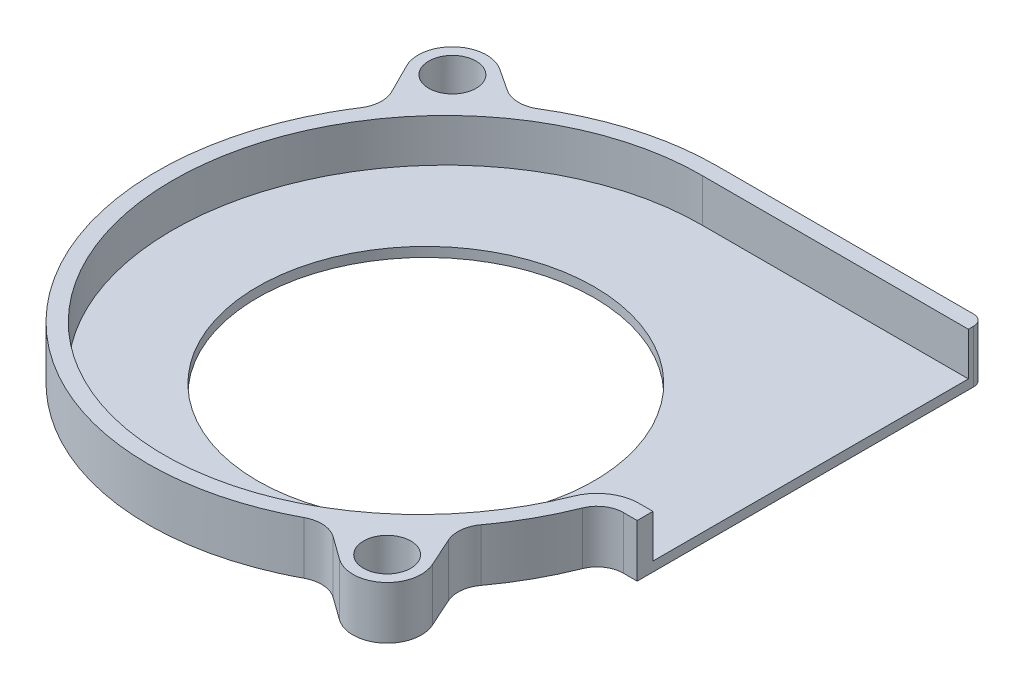
ISO-10303-21;
HEADER;
FILE_DESCRIPTION(('STEP AP214'),'2;1');
FILE_NAME('part.step','',(''),(''),'','','');
FILE_SCHEMA(('AUTOMOTIVE_DESIGN { 1 0 10303 214 1 1 1 1 }'));
ENDSEC;
DATA;
#1=APPLICATION_CONTEXT('core data for automotive mechanical design processes');
#2=APPLICATION_PROTOCOL_DEFINITION('international standard','automotive_design',2000,#1);
#3=PRODUCT_CONTEXT('',#1,'mechanical');
#4=PRODUCT('Part','Part','',(#3));
#5=PRODUCT_RELATED_PRODUCT_CATEGORY('part','',(#4));
#6=PRODUCT_DEFINITION_FORMATION('','',#4);
#7=PRODUCT_DEFINITION_CONTEXT('part definition',#1,'design');
#8=PRODUCT_DEFINITION('design','',#6,#7);
#9=PRODUCT_DEFINITION_SHAPE('','',#8);
#10=(LENGTH_UNIT() NAMED_UNIT(*) SI_UNIT(.MILLI.,.METRE.));
#11=(NAMED_UNIT(*) PLANE_ANGLE_UNIT() SI_UNIT($,.RADIAN.));
#12=(NAMED_UNIT(*) SI_UNIT($,.STERADIAN.) SOLID_ANGLE_UNIT());
#13=UNCERTAINTY_MEASURE_WITH_UNIT(LENGTH_MEASURE(1.E-05),#10,'distance_accuracy_value','');
#14=(GEOMETRIC_REPRESENTATION_CONTEXT(3) GLOBAL_UNCERTAINTY_ASSIGNED_CONTEXT((#13)) GLOBAL_UNIT_ASSIGNED_CONTEXT((#10,
#11,#12)) REPRESENTATION_CONTEXT('',''));
#15=CARTESIAN_POINT('',(0.,0.,0.));
#16=DIRECTION('',(0.,0.,1.));
#17=DIRECTION('',(1.,0.,0.));
#18=AXIS2_PLACEMENT_3D('',#15,#16,#17);
#19=CARTESIAN_POINT('',(-1.25,0.91,-1.9));
#20=DIRECTION('',(0.,1.,0.));
#21=DIRECTION('',(0.,0.,1.));
#22=AXIS2_PLACEMENT_3D('',#19,#20,#21);
#23=PLANE('',#22);
#24=CARTESIAN_POINT('',(0.,0.91,0.));
#25=DIRECTION('',(0.,1.,0.));
#26=DIRECTION('',(0.,0.,1.));
#27=AXIS2_PLACEMENT_3D('',#24,#25,#26);
#28=CIRCLE('',#27,16.);
#29=CARTESIAN_POINT('',(0.,0.91,16.));
#30=VERTEX_POINT('',#29);
#31=EDGE_CURVE('E325',#30,#30,#28,.T.);
#32=ORIENTED_EDGE('',*,*,#31,.F.);
#33=EDGE_LOOP('',(#32));
#34=FACE_BOUND('',#33,.T.);
#35=DIRECTION('',(0.,0.,-1.));
#36=VECTOR('',#35,1.);
#37=CARTESIAN_POINT('',(25.4,0.91,-26.7));
#38=LINE('',#37,#36);
#39=CARTESIAN_POINT('',(25.4,0.91,3.7999999999999));
#40=VERTEX_POINT('',#39);
#41=CARTESIAN_POINT('',(25.4,0.91,-26.2));
#42=VERTEX_POINT('',#41);
#43=EDGE_CURVE('E203',#40,#42,#38,.T.);
#44=ORIENTED_EDGE('',*,*,#43,.T.);
#45=DIRECTION('',(-1.,0.,0.));
#46=VECTOR('',#45,1.);
#47=CARTESIAN_POINT('',(0.134529671720578,0.91,-26.2));
#48=LINE('',#47,#46);
#49=CARTESIAN_POINT('',(0.134529671720578,0.91,-26.2));
#50=VERTEX_POINT('',#49);
#51=EDGE_CURVE('E489',#42,#50,#48,.T.);
#52=ORIENTED_EDGE('',*,*,#51,.T.);
#53=CARTESIAN_POINT('',(-1.25,0.91,-1.9));
#54=DIRECTION('',(0.,1.,0.));
#55=DIRECTION('',(0.469471562785891,0.,-0.882947592858927));
#56=AXIS2_PLACEMENT_3D('',#53,#54,#55);
#57=ELLIPSE('',#56,24.6274274570866,23.1069102992367);
#58=CARTESIAN_POINT('',(20.3675287328341,0.91,6.32255260273751));
#59=VERTEX_POINT('',#58);
#60=EDGE_CURVE('E487',#50,#59,#57,.T.);
#61=ORIENTED_EDGE('',*,*,#60,.T.);
#62=CARTESIAN_POINT('',(24.0846713435397,0.91,7.7999999999998));
#63=DIRECTION('',(0.,-1.,0.));
#64=DIRECTION('',(0.,0.,-1.));
#65=AXIS2_PLACEMENT_3D('',#62,#63,#64);
#66=CIRCLE('',#65,4.);
#67=CARTESIAN_POINT('',(24.0846713435397,0.91,3.7999999999998));
#68=VERTEX_POINT('',#67);
#69=EDGE_CURVE('E221',#59,#68,#66,.T.);
#70=ORIENTED_EDGE('',*,*,#69,.T.);
#71=DIRECTION('',(1.,0.,1.55624504309155E-13));
#72=VECTOR('',#71,1.);
#73=CARTESIAN_POINT('',(25.4,0.91,3.8));
#74=LINE('',#73,#72);
#75=EDGE_CURVE('E219',#68,#40,#74,.T.);
#76=ORIENTED_EDGE('',*,*,#75,.T.);
#77=EDGE_LOOP('',(#44,#52,#61,#70,#76));
#78=FACE_BOUND('',#77,.T.);
#79=ADVANCED_FACE('F34',(#34,#78),#23,.T.);
#80=CARTESIAN_POINT('',(-1.25,0.,-1.9));
#81=DIRECTION('',(0.,1.,0.));
#82=DIRECTION('',(0.,0.,1.));
#83=AXIS2_PLACEMENT_3D('',#80,#81,#82);
#84=PLANE('',#83);
#85=CARTESIAN_POINT('',(16.3234107002611,0.,20.));
#86=DIRECTION('',(0.,1.,0.));
#87=DIRECTION('',(0.,0.,1.));
#88=AXIS2_PLACEMENT_3D('',#85,#86,#87);
#89=CIRCLE('',#88,2.25);
#90=CARTESIAN_POINT('',(16.3234107002611,0.,22.25));
#91=VERTEX_POINT('',#90);
#92=EDGE_CURVE('E321',#91,#91,#89,.T.);
#93=ORIENTED_EDGE('',*,*,#92,.T.);
#94=EDGE_LOOP('',(#93));
#95=FACE_BOUND('',#94,.T.);
#96=CARTESIAN_POINT('',(-1.25,0.,-1.9));
#97=DIRECTION('',(0.,1.,0.));
#98=DIRECTION('',(-0.469471562785891,0.,0.882947592858927));
#99=AXIS2_PLACEMENT_3D('',#96,#97,#98);
#100=ELLIPSE('',#99,26.1274274570866,24.6069102992367);
#101=CARTESIAN_POINT('',(-0.0105819035035217,0.,-27.7));
#102=VERTEX_POINT('',#101);
#103=CARTESIAN_POINT('',(-13.1979154216619,0.,-23.9076836443924));
#104=VERTEX_POINT('',#103);
#105=EDGE_CURVE('E299',#102,#104,#100,.T.);
#106=ORIENTED_EDGE('',*,*,#105,.F.);
#107=DIRECTION('',(-1.,0.,0.));
#108=VECTOR('',#107,1.);
#109=CARTESIAN_POINT('',(-0.0105819035035217,0.,-27.7));
#110=LINE('',#109,#108);
#111=CARTESIAN_POINT('',(24.4,0.,-27.7));
#112=VERTEX_POINT('',#111);
#113=EDGE_CURVE('E197',#112,#102,#110,.T.);
#114=ORIENTED_EDGE('',*,*,#113,.F.);
#115=CARTESIAN_POINT('',(24.4,0.,-26.7));
#116=DIRECTION('',(0.,1.,0.));
#117=DIRECTION('',(0.,0.,1.));
#118=AXIS2_PLACEMENT_3D('',#115,#116,#117);
#119=CIRCLE('',#118,1.);
#120=CARTESIAN_POINT('',(25.4,0.,-26.7));
#121=VERTEX_POINT('',#120);
#122=EDGE_CURVE('E403',#121,#112,#119,.T.);
#123=ORIENTED_EDGE('',*,*,#122,.F.);
#124=DIRECTION('',(0.,0.,-1.));
#125=VECTOR('',#124,1.);
#126=CARTESIAN_POINT('',(25.4,0.,-26.7));
#127=LINE('',#126,#125);
#128=CARTESIAN_POINT('',(25.4,0.,5.3));
#129=VERTEX_POINT('',#128);
#130=EDGE_CURVE('E401',#129,#121,#127,.T.);
#131=ORIENTED_EDGE('',*,*,#130,.F.);
#132=DIRECTION('',(1.,0.,1.54426076720152E-13));
#133=VECTOR('',#132,1.);
#134=CARTESIAN_POINT('',(25.4,0.,5.3));
#135=LINE('',#134,#133);
#136=CARTESIAN_POINT('',(24.0846320678462,0.,5.2999999999998));
#137=VERTEX_POINT('',#136);
#138=EDGE_CURVE('E396',#137,#129,#135,.T.);
#139=ORIENTED_EDGE('',*,*,#138,.F.);
#140=CARTESIAN_POINT('',(24.0846320678458,0.,7.7999999999998));
#141=DIRECTION('',(0.,1.,0.));
#142=DIRECTION('',(0.,0.,1.));
#143=AXIS2_PLACEMENT_3D('',#140,#141,#142);
#144=CIRCLE('',#143,2.5);
#145=CARTESIAN_POINT('',(21.7613985083176,0.,6.87664425713491));
#146=VERTEX_POINT('',#145);
#147=EDGE_CURVE('E11',#137,#146,#144,.T.);
#148=ORIENTED_EDGE('',*,*,#147,.T.);
#149=CARTESIAN_POINT('',(-1.25,0.,-1.9));
#150=DIRECTION('',(0.,1.,0.));
#151=DIRECTION('',(-0.469471562785891,0.,0.882947592858927));
#152=AXIS2_PLACEMENT_3D('',#149,#150,#151);
#153=ELLIPSE('',#152,26.1274274570866,24.6069102992367);
#154=CARTESIAN_POINT('',(18.329372435693,0.,13.0658386746607));
#155=VERTEX_POINT('',#154);
#156=EDGE_CURVE('E394',#155,#146,#153,.T.);
#157=ORIENTED_EDGE('',*,*,#156,.F.);
#158=CARTESIAN_POINT('',(20.5845955875558,0.,14.725347196875));
#159=DIRECTION('',(0.,-1.,0.));
#160=DIRECTION('',(0.,0.,-1.));
#161=AXIS2_PLACEMENT_3D('',#158,#159,#160);
#162=CIRCLE('',#161,2.8);
#163=CARTESIAN_POINT('',(18.0310662864098,0.,15.8740369322644));
#164=VERTEX_POINT('',#163);
#165=EDGE_CURVE('E384',#164,#155,#162,.T.);
#166=ORIENTED_EDGE('',*,*,#165,.F.);
#167=DIRECTION('',(-0.410246334067643,0.,-0.911974750409275));
#168=VECTOR('',#167,1.);
#169=CARTESIAN_POINT('',(19.2873286390912,0.,18.6666994142802));
#170=LINE('',#169,#168);
#171=CARTESIAN_POINT('',(19.2873286390912,0.,18.6666994142802));
#172=VERTEX_POINT('',#171);
#173=EDGE_CURVE('E376',#172,#164,#170,.T.);
#174=ORIENTED_EDGE('',*,*,#173,.F.);
#175=CARTESIAN_POINT('',(16.3234107002611,0.,20.));
#176=DIRECTION('',(0.,1.,0.));
#177=DIRECTION('',(0.,0.,1.));
#178=AXIS2_PLACEMENT_3D('',#175,#176,#177);
#179=CIRCLE('',#178,3.25);
#180=CARTESIAN_POINT('',(14.4232327633617,0.,22.6366311475291));
#181=VERTEX_POINT('',#180);
#182=EDGE_CURVE('E385',#181,#172,#179,.T.);
#183=ORIENTED_EDGE('',*,*,#182,.F.);
#184=DIRECTION('',(0.811271122316656,0.,0.584670134430581));
#185=VECTOR('',#184,1.);
#186=CARTESIAN_POINT('',(14.4232327633617,0.,22.6366311475291));
#187=LINE('',#186,#185);
#188=CARTESIAN_POINT('',(12.2821486377982,0.,21.0935860309401));
#189=VERTEX_POINT('',#188);
#190=EDGE_CURVE('E530',#189,#181,#187,.T.);
#191=ORIENTED_EDGE('',*,*,#190,.F.);
#192=CARTESIAN_POINT('',(10.6450722613925,0.,23.3651451734267));
#193=DIRECTION('',(0.,-1.,0.));
#194=DIRECTION('',(0.,0.,1.));
#195=AXIS2_PLACEMENT_3D('',#192,#193,#194);
#196=CIRCLE('',#195,2.8);
#197=CARTESIAN_POINT('',(9.32486275644242,0.,20.8959252838585));
#198=VERTEX_POINT('',#197);
#199=EDGE_CURVE('E528',#198,#189,#196,.T.);
#200=ORIENTED_EDGE('',*,*,#199,.F.);
#201=CARTESIAN_POINT('',(-1.25,0.,-1.9));
#202=DIRECTION('',(0.,1.,0.));
#203=DIRECTION('',(-0.469471562785891,0.,0.882947592858927));
#204=AXIS2_PLACEMENT_3D('',#201,#202,#203);
#205=ELLIPSE('',#204,26.1274274570866,24.6069102992367);
#206=CARTESIAN_POINT('',(-21.7385883574107,0.,-15.5524033943181));
#207=VERTEX_POINT('',#206);
#208=EDGE_CURVE('E526',#207,#198,#205,.T.);
#209=ORIENTED_EDGE('',*,*,#208,.F.);
#210=CARTESIAN_POINT('',(-24.0858236778098,0.,-17.0789964477121));
#211=DIRECTION('',(0.,-1.,0.));
#212=DIRECTION('',(0.,0.,-1.));
#213=AXIS2_PLACEMENT_3D('',#210,#211,#212);
#214=CIRCLE('',#213,2.8);
#215=CARTESIAN_POINT('',(-21.5824509490174,0.,-18.3332392394948));
#216=VERTEX_POINT('',#215);
#217=EDGE_CURVE('E524',#216,#207,#214,.T.);
#218=ORIENTED_EDGE('',*,*,#217,.F.);
#219=DIRECTION('',(0.44794385420809,0.,0.894061688854411));
#220=VECTOR('',#219,1.);
#221=CARTESIAN_POINT('',(-23.0057004887768,0.,-21.1739365171215));
#222=LINE('',#221,#220);
#223=CARTESIAN_POINT('',(-23.0057004887768,0.,-21.1739365171215));
#224=VERTEX_POINT('',#223);
#225=EDGE_CURVE('E522',#224,#216,#222,.T.);
#226=ORIENTED_EDGE('',*,*,#225,.F.);
#227=CARTESIAN_POINT('',(-20.1,0.,-22.6297540432978));
#228=DIRECTION('',(0.,1.,0.));
#229=DIRECTION('',(0.,0.,1.));
#230=AXIS2_PLACEMENT_3D('',#227,#228,#229);
#231=CIRCLE('',#230,3.24999999999999);
#232=CARTESIAN_POINT('',(-18.3114983240186,0.,-25.3433792486295));
#233=VERTEX_POINT('',#232);
#234=EDGE_CURVE('E518',#233,#224,#231,.T.);
#235=ORIENTED_EDGE('',*,*,#234,.F.);
#236=DIRECTION('',(-0.834961601640525,0.,-0.550308207994293));
#237=VECTOR('',#236,1.);
#238=CARTESIAN_POINT('',(-18.3114983240186,0.,-25.3433792486295));
#239=LINE('',#238,#237);
#240=CARTESIAN_POINT('',(-16.2051412765258,0.,-23.9551171178627));
#241=VERTEX_POINT('',#240);
#242=EDGE_CURVE('E517',#241,#233,#239,.T.);
#243=ORIENTED_EDGE('',*,*,#242,.F.);
#244=CARTESIAN_POINT('',(-14.6642782941418,0.,-26.2930096024562));
#245=DIRECTION('',(0.,-1.,0.));
#246=DIRECTION('',(0.,0.,1.));
#247=AXIS2_PLACEMENT_3D('',#244,#245,#246);
#248=CIRCLE('',#247,2.8);
#249=EDGE_CURVE('E516',#104,#241,#248,.T.);
#250=ORIENTED_EDGE('',*,*,#249,.F.);
#251=EDGE_LOOP('',(#106,#114,#123,#131,#139,#148,#157,#166,#174,#183,#191,#200,#209,#218,#226,
#235,#243,#250));
#252=FACE_BOUND('',#251,.T.);
#253=CARTESIAN_POINT('',(0.,0.,0.));
#254=DIRECTION('',(0.,1.,0.));
#255=DIRECTION('',(0.,0.,1.));
#256=AXIS2_PLACEMENT_3D('',#253,#254,#255);
#257=CIRCLE('',#256,16.);
#258=CARTESIAN_POINT('',(0.,0.,16.));
#259=VERTEX_POINT('',#258);
#260=EDGE_CURVE('E324',#259,#259,#257,.T.);
#261=ORIENTED_EDGE('',*,*,#260,.T.);
#262=EDGE_LOOP('',(#261));
#263=FACE_BOUND('',#262,.T.);
#264=CARTESIAN_POINT('',(-20.1,0.,-22.6297540432978));
#265=DIRECTION('',(0.,1.,0.));
#266=DIRECTION('',(0.,0.,1.));
#267=AXIS2_PLACEMENT_3D('',#264,#265,#266);
#268=CIRCLE('',#267,2.25);
#269=CARTESIAN_POINT('',(-20.1,0.,-20.3797540432978));
#270=VERTEX_POINT('',#269);
#271=EDGE_CURVE('E318',#270,#270,#268,.T.);
#272=ORIENTED_EDGE('',*,*,#271,.T.);
#273=EDGE_LOOP('',(#272));
#274=FACE_BOUND('',#273,.T.);
#275=ADVANCED_FACE('F266',(#95,#252,#263,#274),#84,.F.);
#276=CARTESIAN_POINT('',(-1.25,0.91,-1.9));
#277=DIRECTION('',(0.,1.,0.));
#278=DIRECTION('',(-0.469471562785891,0.,0.882947592858927));
#279=AXIS2_PLACEMENT_3D('',#276,#277,#278);
#280=ELLIPSE('',#279,26.1274274570866,24.6069102992367);
#281=DIRECTION('',(0.,-1.,0.));
#282=VECTOR('',#281,1.);
#283=SURFACE_OF_LINEAR_EXTRUSION('',#280,#282);
#284=ORIENTED_EDGE('',*,*,#105,.T.);
#285=DIRECTION('',(0.,-1.,0.));
#286=VECTOR('',#285,1.);
#287=CARTESIAN_POINT('',(-13.1979154216619,0.91,-23.9076836443924));
#288=LINE('',#287,#286);
#289=CARTESIAN_POINT('',(-13.1979154216619,5.,-23.9076836443924));
#290=VERTEX_POINT('',#289);
#291=EDGE_CURVE('E218',#290,#104,#288,.T.);
#292=ORIENTED_EDGE('',*,*,#291,.F.);
#293=CARTESIAN_POINT('',(-1.25,5.,-1.9));
#294=DIRECTION('',(0.,-1.,0.));
#295=DIRECTION('',(-0.469471562785892,0.,0.882947592858927));
#296=AXIS2_PLACEMENT_3D('',#293,#294,#295);
#297=ELLIPSE('',#296,26.1274274570866,24.6069102992367);
#298=CARTESIAN_POINT('',(-0.01058190350352,5.,-27.7));
#299=VERTEX_POINT('',#298);
#300=EDGE_CURVE('E210',#290,#299,#297,.T.);
#301=ORIENTED_EDGE('',*,*,#300,.T.);
#302=DIRECTION('',(0.,-1.,0.));
#303=VECTOR('',#302,1.);
#304=CARTESIAN_POINT('',(-0.0105819035035217,0.91,-27.7));
#305=LINE('',#304,#303);
#306=EDGE_CURVE('E191',#299,#102,#305,.T.);
#307=ORIENTED_EDGE('',*,*,#306,.T.);
#308=EDGE_LOOP('',(#284,#292,#301,#307));
#309=FACE_BOUND('',#308,.T.);
#310=ADVANCED_FACE('F216',(#309),#283,.F.);
#311=CARTESIAN_POINT('',(-14.6642782941418,0.91,-26.2930096024562));
#312=DIRECTION('',(0.,-1.,0.));
#313=DIRECTION('',(0.,0.,-1.));
#314=AXIS2_PLACEMENT_3D('',#311,#312,#313);
#315=CYLINDRICAL_SURFACE('',#314,2.8);
#316=ORIENTED_EDGE('',*,*,#249,.T.);
#317=DIRECTION('',(0.,-1.,0.));
#318=VECTOR('',#317,1.);
#319=CARTESIAN_POINT('',(-16.2051412765258,0.91,-23.9551171178627));
#320=LINE('',#319,#318);
#321=CARTESIAN_POINT('',(-16.2051412765258,5.,-23.9551171178627));
#322=VERTEX_POINT('',#321);
#323=EDGE_CURVE('E436',#322,#241,#320,.T.);
#324=ORIENTED_EDGE('',*,*,#323,.F.);
#325=CARTESIAN_POINT('',(-14.6642782941418,5.,-26.2930096024562));
#326=DIRECTION('',(0.,1.,0.));
#327=DIRECTION('',(0.,0.,-1.));
#328=AXIS2_PLACEMENT_3D('',#325,#326,#327);
#329=CIRCLE('',#328,2.8);
#330=EDGE_CURVE('E486',#322,#290,#329,.T.);
#331=ORIENTED_EDGE('',*,*,#330,.T.);
#332=ORIENTED_EDGE('',*,*,#291,.T.);
#333=EDGE_LOOP('',(#316,#324,#331,#332));
#334=FACE_BOUND('',#333,.T.);
#335=ADVANCED_FACE('F332',(#334),#315,.F.);
#336=CARTESIAN_POINT('',(-18.3114983240186,0.91,-25.3433792486295));
#337=DIRECTION('',(-0.550308207994293,0.,0.834961601640525));
#338=DIRECTION('',(0.834961601640525,0.,0.550308207994293));
#339=AXIS2_PLACEMENT_3D('',#336,#337,#338);
#340=PLANE('',#339);
#341=ORIENTED_EDGE('',*,*,#242,.T.);
#342=DIRECTION('',(0.,-1.,0.));
#343=VECTOR('',#342,1.);
#344=CARTESIAN_POINT('',(-18.3114983240186,0.91,-25.3433792486295));
#345=LINE('',#344,#343);
#346=CARTESIAN_POINT('',(-18.3114983240186,5.,-25.3433792486295));
#347=VERTEX_POINT('',#346);
#348=EDGE_CURVE('E433',#347,#233,#345,.T.);
#349=ORIENTED_EDGE('',*,*,#348,.F.);
#350=DIRECTION('',(0.834961601640526,0.,0.55030820799429));
#351=VECTOR('',#350,1.);
#352=CARTESIAN_POINT('',(-18.3114983240186,5.,-25.3433792486295));
#353=LINE('',#352,#351);
#354=EDGE_CURVE('E483',#347,#322,#353,.T.);
#355=ORIENTED_EDGE('',*,*,#354,.T.);
#356=ORIENTED_EDGE('',*,*,#323,.T.);
#357=EDGE_LOOP('',(#341,#349,#355,#356));
#358=FACE_BOUND('',#357,.T.);
#359=ADVANCED_FACE('F335',(#358),#340,.F.);
#360=CARTESIAN_POINT('',(-20.1,0.91,-22.6297540432978));
#361=DIRECTION('',(0.,-1.,0.));
#362=DIRECTION('',(0.,0.,-1.));
#363=AXIS2_PLACEMENT_3D('',#360,#361,#362);
#364=CYLINDRICAL_SURFACE('',#363,3.24999999999999);
#365=ORIENTED_EDGE('',*,*,#234,.T.);
#366=DIRECTION('',(0.,-1.,0.));
#367=VECTOR('',#366,1.);
#368=CARTESIAN_POINT('',(-23.0057004887768,0.91,-21.1739365171215));
#369=LINE('',#368,#367);
#370=CARTESIAN_POINT('',(-23.0057004887768,5.,-21.1739365171215));
#371=VERTEX_POINT('',#370);
#372=EDGE_CURVE('E430',#371,#224,#369,.T.);
#373=ORIENTED_EDGE('',*,*,#372,.F.);
#374=CARTESIAN_POINT('',(-20.1,5.,-22.6297540432978));
#375=DIRECTION('',(0.,-1.,0.));
#376=DIRECTION('',(0.,0.,-1.));
#377=AXIS2_PLACEMENT_3D('',#374,#375,#376);
#378=CIRCLE('',#377,3.24999999999999);
#379=EDGE_CURVE('E480',#371,#347,#378,.T.);
#380=ORIENTED_EDGE('',*,*,#379,.T.);
#381=ORIENTED_EDGE('',*,*,#348,.T.);
#382=EDGE_LOOP('',(#365,#373,#380,#381));
#383=FACE_BOUND('',#382,.T.);
#384=ADVANCED_FACE('F339',(#383),#364,.T.);
#385=CARTESIAN_POINT('',(-23.0057004887768,0.91,-21.1739365171215));
#386=DIRECTION('',(0.894061688854411,0.,-0.44794385420809));
#387=DIRECTION('',(-0.44794385420809,0.,-0.894061688854411));
#388=AXIS2_PLACEMENT_3D('',#385,#386,#387);
#389=PLANE('',#388);
#390=ORIENTED_EDGE('',*,*,#225,.T.);
#391=DIRECTION('',(0.,-1.,0.));
#392=VECTOR('',#391,1.);
#393=CARTESIAN_POINT('',(-21.5824509490174,0.91,-18.3332392394948));
#394=LINE('',#393,#392);
#395=CARTESIAN_POINT('',(-21.5824509490175,5.,-18.3332392394948));
#396=VERTEX_POINT('',#395);
#397=EDGE_CURVE('E427',#396,#216,#394,.T.);
#398=ORIENTED_EDGE('',*,*,#397,.F.);
#399=DIRECTION('',(-0.447943854208092,0.,-0.89406168885441));
#400=VECTOR('',#399,1.);
#401=CARTESIAN_POINT('',(-23.0057004887768,5.,-21.1739365171215));
#402=LINE('',#401,#400);
#403=EDGE_CURVE('E477',#396,#371,#402,.T.);
#404=ORIENTED_EDGE('',*,*,#403,.T.);
#405=ORIENTED_EDGE('',*,*,#372,.T.);
#406=EDGE_LOOP('',(#390,#398,#404,#405));
#407=FACE_BOUND('',#406,.T.);
#408=ADVANCED_FACE('F343',(#407),#389,.F.);
#409=CARTESIAN_POINT('',(-24.0858236778098,0.91,-17.0789964477121));
#410=DIRECTION('',(0.,-1.,0.));
#411=DIRECTION('',(0.,0.,-1.));
#412=AXIS2_PLACEMENT_3D('',#409,#410,#411);
#413=CYLINDRICAL_SURFACE('',#412,2.8);
#414=ORIENTED_EDGE('',*,*,#217,.T.);
#415=DIRECTION('',(0.,-1.,0.));
#416=VECTOR('',#415,1.);
#417=CARTESIAN_POINT('',(-21.7385883574107,0.91,-15.5524033943181));
#418=LINE('',#417,#416);
#419=CARTESIAN_POINT('',(-21.7385883574107,5.,-15.5524033943181));
#420=VERTEX_POINT('',#419);
#421=EDGE_CURVE('E424',#420,#207,#418,.T.);
#422=ORIENTED_EDGE('',*,*,#421,.F.);
#423=CARTESIAN_POINT('',(-24.0858236778098,5.,-17.0789964477121));
#424=DIRECTION('',(0.,1.,0.));
#425=DIRECTION('',(0.,0.,-1.));
#426=AXIS2_PLACEMENT_3D('',#423,#424,#425);
#427=CIRCLE('',#426,2.8);
#428=EDGE_CURVE('E474',#420,#396,#427,.T.);
#429=ORIENTED_EDGE('',*,*,#428,.T.);
#430=ORIENTED_EDGE('',*,*,#397,.T.);
#431=EDGE_LOOP('',(#414,#422,#429,#430));
#432=FACE_BOUND('',#431,.T.);
#433=ADVANCED_FACE('F347',(#432),#413,.F.);
#434=CARTESIAN_POINT('',(-1.25,0.91,-1.9));
#435=DIRECTION('',(0.,1.,0.));
#436=DIRECTION('',(-0.469471562785891,0.,0.882947592858927));
#437=AXIS2_PLACEMENT_3D('',#434,#435,#436);
#438=ELLIPSE('',#437,26.1274274570866,24.6069102992367);
#439=DIRECTION('',(0.,-1.,0.));
#440=VECTOR('',#439,1.);
#441=SURFACE_OF_LINEAR_EXTRUSION('',#438,#440);
#442=ORIENTED_EDGE('',*,*,#208,.T.);
#443=DIRECTION('',(0.,-1.,0.));
#444=VECTOR('',#443,1.);
#445=CARTESIAN_POINT('',(9.32486275644242,0.91,20.8959252838585));
#446=LINE('',#445,#444);
#447=CARTESIAN_POINT('',(9.32486275644242,5.,20.8959252838585));
#448=VERTEX_POINT('',#447);
#449=EDGE_CURVE('E421',#448,#198,#446,.T.);
#450=ORIENTED_EDGE('',*,*,#449,.F.);
#451=CARTESIAN_POINT('',(-1.25,5.,-1.9));
#452=DIRECTION('',(0.,-1.,0.));
#453=DIRECTION('',(-0.469471562785892,0.,0.882947592858927));
#454=AXIS2_PLACEMENT_3D('',#451,#452,#453);
#455=ELLIPSE('',#454,26.1274274570866,24.6069102992367);
#456=EDGE_CURVE('E471',#448,#420,#455,.T.);
#457=ORIENTED_EDGE('',*,*,#456,.T.);
#458=ORIENTED_EDGE('',*,*,#421,.T.);
#459=EDGE_LOOP('',(#442,#450,#457,#458));
#460=FACE_BOUND('',#459,.T.);
#461=ADVANCED_FACE('F351',(#460),#441,.F.);
#462=CARTESIAN_POINT('',(10.6450722613925,0.91,23.3651451734267));
#463=DIRECTION('',(0.,-1.,0.));
#464=DIRECTION('',(0.,0.,-1.));
#465=AXIS2_PLACEMENT_3D('',#462,#463,#464);
#466=CYLINDRICAL_SURFACE('',#465,2.8);
#467=ORIENTED_EDGE('',*,*,#199,.T.);
#468=DIRECTION('',(0.,-1.,0.));
#469=VECTOR('',#468,1.);
#470=CARTESIAN_POINT('',(12.2821486377982,0.91,21.0935860309401));
#471=LINE('',#470,#469);
#472=CARTESIAN_POINT('',(12.2821486377982,5.,21.0935860309401));
#473=VERTEX_POINT('',#472);
#474=EDGE_CURVE('E418',#473,#189,#471,.T.);
#475=ORIENTED_EDGE('',*,*,#474,.F.);
#476=CARTESIAN_POINT('',(10.6450722613925,5.,23.3651451734267));
#477=DIRECTION('',(0.,1.,0.));
#478=DIRECTION('',(0.,0.,-1.));
#479=AXIS2_PLACEMENT_3D('',#476,#477,#478);
#480=CIRCLE('',#479,2.8);
#481=EDGE_CURVE('E468',#473,#448,#480,.T.);
#482=ORIENTED_EDGE('',*,*,#481,.T.);
#483=ORIENTED_EDGE('',*,*,#449,.T.);
#484=EDGE_LOOP('',(#467,#475,#482,#483));
#485=FACE_BOUND('',#484,.T.);
#486=ADVANCED_FACE('F355',(#485),#466,.F.);
#487=CARTESIAN_POINT('',(14.4232327633617,0.91,22.6366311475291));
#488=DIRECTION('',(0.584670134430581,0.,-0.811271122316656));
#489=DIRECTION('',(-0.811271122316656,0.,-0.584670134430581));
#490=AXIS2_PLACEMENT_3D('',#487,#488,#489);
#491=PLANE('',#490);
#492=ORIENTED_EDGE('',*,*,#190,.T.);
#493=DIRECTION('',(0.,-1.,0.));
#494=VECTOR('',#493,1.);
#495=CARTESIAN_POINT('',(14.4232327633617,0.91,22.6366311475291));
#496=LINE('',#495,#494);
#497=CARTESIAN_POINT('',(14.4232327633617,5.,22.6366311475291));
#498=VERTEX_POINT('',#497);
#499=EDGE_CURVE('E415',#498,#181,#496,.T.);
#500=ORIENTED_EDGE('',*,*,#499,.F.);
#501=DIRECTION('',(-0.811271122316656,0.,-0.584670134430581));
#502=VECTOR('',#501,1.);
#503=CARTESIAN_POINT('',(14.4232327633617,5.,22.6366311475291));
#504=LINE('',#503,#502);
#505=EDGE_CURVE('E465',#498,#473,#504,.T.);
#506=ORIENTED_EDGE('',*,*,#505,.T.);
#507=ORIENTED_EDGE('',*,*,#474,.T.);
#508=EDGE_LOOP('',(#492,#500,#506,#507));
#509=FACE_BOUND('',#508,.T.);
#510=ADVANCED_FACE('F359',(#509),#491,.F.);
#511=CARTESIAN_POINT('',(16.3234107002611,0.91,20.));
#512=DIRECTION('',(0.,-1.,0.));
#513=DIRECTION('',(0.,0.,-1.));
#514=AXIS2_PLACEMENT_3D('',#511,#512,#513);
#515=CYLINDRICAL_SURFACE('',#514,3.25);
#516=ORIENTED_EDGE('',*,*,#182,.T.);
#517=DIRECTION('',(0.,-1.,0.));
#518=VECTOR('',#517,1.);
#519=CARTESIAN_POINT('',(19.2873286390912,0.91,18.6666994142802));
#520=LINE('',#519,#518);
#521=CARTESIAN_POINT('',(19.2873286390912,5.,18.6666994142802));
#522=VERTEX_POINT('',#521);
#523=EDGE_CURVE('E381',#522,#172,#520,.T.);
#524=ORIENTED_EDGE('',*,*,#523,.F.);
#525=CARTESIAN_POINT('',(16.3234107002611,5.,20.));
#526=DIRECTION('',(0.,-1.,0.));
#527=DIRECTION('',(0.,0.,-1.));
#528=AXIS2_PLACEMENT_3D('',#525,#526,#527);
#529=CIRCLE('',#528,3.25);
#530=EDGE_CURVE('E462',#522,#498,#529,.T.);
#531=ORIENTED_EDGE('',*,*,#530,.T.);
#532=ORIENTED_EDGE('',*,*,#499,.T.);
#533=EDGE_LOOP('',(#516,#524,#531,#532));
#534=FACE_BOUND('',#533,.T.);
#535=ADVANCED_FACE('F363',(#534),#515,.T.);
#536=CARTESIAN_POINT('',(19.2873286390912,0.91,18.6666994142802));
#537=DIRECTION('',(-0.911974750409275,0.,0.410246334067643));
#538=DIRECTION('',(0.410246334067643,0.,0.911974750409275));
#539=AXIS2_PLACEMENT_3D('',#536,#537,#538);
#540=PLANE('',#539);
#541=ORIENTED_EDGE('',*,*,#173,.T.);
#542=DIRECTION('',(0.,-1.,0.));
#543=VECTOR('',#542,1.);
#544=CARTESIAN_POINT('',(18.0310662864098,0.91,15.8740369322644));
#545=LINE('',#544,#543);
#546=CARTESIAN_POINT('',(18.0310662864098,5.,15.8740369322644));
#547=VERTEX_POINT('',#546);
#548=EDGE_CURVE('E379',#547,#164,#545,.T.);
#549=ORIENTED_EDGE('',*,*,#548,.F.);
#550=DIRECTION('',(0.410246334067644,0.,0.911974750409275));
#551=VECTOR('',#550,1.);
#552=CARTESIAN_POINT('',(19.2873286390912,5.,18.6666994142802));
#553=LINE('',#552,#551);
#554=EDGE_CURVE('E460',#547,#522,#553,.T.);
#555=ORIENTED_EDGE('',*,*,#554,.T.);
#556=ORIENTED_EDGE('',*,*,#523,.T.);
#557=EDGE_LOOP('',(#541,#549,#555,#556));
#558=FACE_BOUND('',#557,.T.);
#559=ADVANCED_FACE('F366',(#558),#540,.F.);
#560=CARTESIAN_POINT('',(20.5845955875558,0.91,14.725347196875));
#561=DIRECTION('',(0.,-1.,0.));
#562=DIRECTION('',(0.,0.,-1.));
#563=AXIS2_PLACEMENT_3D('',#560,#561,#562);
#564=CYLINDRICAL_SURFACE('',#563,2.8);
#565=ORIENTED_EDGE('',*,*,#165,.T.);
#566=DIRECTION('',(0.,-1.,0.));
#567=VECTOR('',#566,1.);
#568=CARTESIAN_POINT('',(18.329372435693,0.91,13.0658386746607));
#569=LINE('',#568,#567);
#570=CARTESIAN_POINT('',(18.329372435693,5.,13.0658386746607));
#571=VERTEX_POINT('',#570);
#572=EDGE_CURVE('E391',#571,#155,#569,.T.);
#573=ORIENTED_EDGE('',*,*,#572,.F.);
#574=CARTESIAN_POINT('',(20.5845955875558,5.,14.725347196875));
#575=DIRECTION('',(0.,1.,0.));
#576=DIRECTION('',(0.,0.,-1.));
#577=AXIS2_PLACEMENT_3D('',#574,#575,#576);
#578=CIRCLE('',#577,2.8);
#579=EDGE_CURVE('E390',#571,#547,#578,.T.);
#580=ORIENTED_EDGE('',*,*,#579,.T.);
#581=ORIENTED_EDGE('',*,*,#548,.T.);
#582=EDGE_LOOP('',(#565,#573,#580,#581));
#583=FACE_BOUND('',#582,.T.);
#584=ADVANCED_FACE('F289',(#583),#564,.F.);
#585=CARTESIAN_POINT('',(-1.25,0.91,-1.9));
#586=DIRECTION('',(0.,1.,0.));
#587=DIRECTION('',(-0.469471562785891,0.,0.882947592858927));
#588=AXIS2_PLACEMENT_3D('',#585,#586,#587);
#589=ELLIPSE('',#588,26.1274274570866,24.6069102992367);
#590=DIRECTION('',(0.,-1.,0.));
#591=VECTOR('',#590,1.);
#592=SURFACE_OF_LINEAR_EXTRUSION('',#589,#591);
#593=ORIENTED_EDGE('',*,*,#156,.T.);
#594=DIRECTION('',(0.,-1.,0.));
#595=VECTOR('',#594,1.);
#596=CARTESIAN_POINT('',(21.7613985083176,0.,6.87664425713491));
#597=LINE('',#596,#595);
#598=CARTESIAN_POINT('',(21.7613985083176,5.,6.87664425713491));
#599=VERTEX_POINT('',#598);
#600=EDGE_CURVE('E43',#146,#599,#597,.F.);
#601=ORIENTED_EDGE('',*,*,#600,.T.);
#602=CARTESIAN_POINT('',(-1.25,5.,-1.9));
#603=DIRECTION('',(0.,-1.,0.));
#604=DIRECTION('',(-0.469471562785892,0.,0.882947592858927));
#605=AXIS2_PLACEMENT_3D('',#602,#603,#604);
#606=ELLIPSE('',#605,26.1274274570866,24.6069102992367);
#607=EDGE_CURVE('E445',#599,#571,#606,.T.);
#608=ORIENTED_EDGE('',*,*,#607,.T.);
#609=ORIENTED_EDGE('',*,*,#572,.T.);
#610=EDGE_LOOP('',(#593,#601,#608,#609));
#611=FACE_BOUND('',#610,.T.);
#612=ADVANCED_FACE('F284',(#611),#592,.F.);
#613=CARTESIAN_POINT('',(25.4,0.91,5.3));
#614=DIRECTION('',(1.54426076720152E-13,0.,-1.));
#615=DIRECTION('',(-1.,0.,-1.54426076720152E-13));
#616=AXIS2_PLACEMENT_3D('',#613,#614,#615);
#617=PLANE('',#616);
#618=DIRECTION('',(0.,-1.,0.));
#619=VECTOR('',#618,1.);
#620=CARTESIAN_POINT('',(25.4,0.91,5.3));
#621=LINE('',#620,#619);
#622=CARTESIAN_POINT('',(25.4,5.,5.3));
#623=VERTEX_POINT('',#622);
#624=EDGE_CURVE('E410',#623,#129,#621,.T.);
#625=ORIENTED_EDGE('',*,*,#624,.F.);
#626=DIRECTION('',(-1.,0.,-1.54301045150885E-13));
#627=VECTOR('',#626,1.);
#628=CARTESIAN_POINT('',(25.4,5.,5.3));
#629=LINE('',#628,#627);
#630=CARTESIAN_POINT('',(24.0846320678462,5.,5.2999999999998));
#631=VERTEX_POINT('',#630);
#632=EDGE_CURVE('E453',#623,#631,#629,.T.);
#633=ORIENTED_EDGE('',*,*,#632,.T.);
#634=DIRECTION('',(0.,1.,0.));
#635=VECTOR('',#634,1.);
#636=CARTESIAN_POINT('',(24.0846320678462,0.,5.2999999999998));
#637=LINE('',#636,#635);
#638=EDGE_CURVE('E440',#631,#137,#637,.F.);
#639=ORIENTED_EDGE('',*,*,#638,.T.);
#640=ORIENTED_EDGE('',*,*,#138,.T.);
#641=EDGE_LOOP('',(#625,#633,#639,#640));
#642=FACE_BOUND('',#641,.T.);
#643=ADVANCED_FACE('F280',(#642),#617,.F.);
#644=CARTESIAN_POINT('',(25.4,0.91,-26.7));
#645=DIRECTION('',(-1.,0.,0.));
#646=DIRECTION('',(0.,0.,1.));
#647=AXIS2_PLACEMENT_3D('',#644,#645,#646);
#648=PLANE('',#647);
#649=ORIENTED_EDGE('',*,*,#130,.T.);
#650=DIRECTION('',(0.,-1.,0.));
#651=VECTOR('',#650,1.);
#652=CARTESIAN_POINT('',(25.4,0.91,-26.7));
#653=LINE('',#652,#651);
#654=CARTESIAN_POINT('',(25.4,5.,-26.7));
#655=VERTEX_POINT('',#654);
#656=EDGE_CURVE('E407',#655,#121,#653,.T.);
#657=ORIENTED_EDGE('',*,*,#656,.F.);
#658=DIRECTION('',(0.,0.,1.));
#659=VECTOR('',#658,1.);
#660=CARTESIAN_POINT('',(25.4,5.,-26.7));
#661=LINE('',#660,#659);
#662=CARTESIAN_POINT('',(25.4,5.,-26.2));
#663=VERTEX_POINT('',#662);
#664=EDGE_CURVE('E228',#655,#663,#661,.T.);
#665=ORIENTED_EDGE('',*,*,#664,.T.);
#666=DIRECTION('',(0.,-1.,0.));
#667=VECTOR('',#666,1.);
#668=CARTESIAN_POINT('',(25.4,5.,-26.2));
#669=LINE('',#668,#667);
#670=EDGE_CURVE('E317',#663,#42,#669,.T.);
#671=ORIENTED_EDGE('',*,*,#670,.T.);
#672=ORIENTED_EDGE('',*,*,#43,.F.);
#673=DIRECTION('',(0.,-1.,0.));
#674=VECTOR('',#673,1.);
#675=CARTESIAN_POINT('',(25.4,5.,3.8));
#676=LINE('',#675,#674);
#677=CARTESIAN_POINT('',(25.4,5.,3.8));
#678=VERTEX_POINT('',#677);
#679=EDGE_CURVE('E51',#678,#40,#676,.T.);
#680=ORIENTED_EDGE('',*,*,#679,.F.);
#681=DIRECTION('',(0.,0.,1.));
#682=VECTOR('',#681,1.);
#683=CARTESIAN_POINT('',(25.4,5.,3.8));
#684=LINE('',#683,#682);
#685=EDGE_CURVE('E455',#678,#623,#684,.T.);
#686=ORIENTED_EDGE('',*,*,#685,.T.);
#687=ORIENTED_EDGE('',*,*,#624,.T.);
#688=EDGE_LOOP('',(#649,#657,#665,#671,#672,#680,#686,#687));
#689=FACE_BOUND('',#688,.T.);
#690=ADVANCED_FACE('F276',(#689),#648,.F.);
#691=CARTESIAN_POINT('',(24.4,0.91,-26.7));
#692=DIRECTION('',(0.,-1.,0.));
#693=DIRECTION('',(0.,0.,-1.));
#694=AXIS2_PLACEMENT_3D('',#691,#692,#693);
#695=CYLINDRICAL_SURFACE('',#694,1.);
#696=ORIENTED_EDGE('',*,*,#122,.T.);
#697=DIRECTION('',(0.,-1.,0.));
#698=VECTOR('',#697,1.);
#699=CARTESIAN_POINT('',(24.4,0.91,-27.7));
#700=LINE('',#699,#698);
#701=CARTESIAN_POINT('',(24.4,5.,-27.7));
#702=VERTEX_POINT('',#701);
#703=EDGE_CURVE('E202',#702,#112,#700,.T.);
#704=ORIENTED_EDGE('',*,*,#703,.F.);
#705=CARTESIAN_POINT('',(24.4,5.,-26.7));
#706=DIRECTION('',(0.,-1.,0.));
#707=DIRECTION('',(0.,0.,-1.));
#708=AXIS2_PLACEMENT_3D('',#705,#706,#707);
#709=CIRCLE('',#708,1.);
#710=EDGE_CURVE('E214',#702,#655,#709,.T.);
#711=ORIENTED_EDGE('',*,*,#710,.T.);
#712=ORIENTED_EDGE('',*,*,#656,.T.);
#713=EDGE_LOOP('',(#696,#704,#711,#712));
#714=FACE_BOUND('',#713,.T.);
#715=ADVANCED_FACE('F273',(#714),#695,.T.);
#716=CARTESIAN_POINT('',(-0.0105819035035217,0.91,-27.7));
#717=DIRECTION('',(0.,0.,1.));
#718=DIRECTION('',(1.,0.,0.));
#719=AXIS2_PLACEMENT_3D('',#716,#717,#718);
#720=PLANE('',#719);
#721=ORIENTED_EDGE('',*,*,#113,.T.);
#722=ORIENTED_EDGE('',*,*,#306,.F.);
#723=DIRECTION('',(1.,0.,0.));
#724=VECTOR('',#723,1.);
#725=CARTESIAN_POINT('',(-0.01058190350352,5.,-27.7));
#726=LINE('',#725,#724);
#727=EDGE_CURVE('E195',#299,#702,#726,.T.);
#728=ORIENTED_EDGE('',*,*,#727,.T.);
#729=ORIENTED_EDGE('',*,*,#703,.T.);
#730=EDGE_LOOP('',(#721,#722,#728,#729));
#731=FACE_BOUND('',#730,.T.);
#732=ADVANCED_FACE('F193',(#731),#720,.F.);
#733=CARTESIAN_POINT('',(0.,0.91,0.));
#734=DIRECTION('',(0.,-1.,0.));
#735=DIRECTION('',(0.,0.,-1.));
#736=AXIS2_PLACEMENT_3D('',#733,#734,#735);
#737=CYLINDRICAL_SURFACE('',#736,16.);
#738=ORIENTED_EDGE('',*,*,#31,.T.);
#739=EDGE_LOOP('',(#738));
#740=FACE_BOUND('',#739,.T.);
#741=ORIENTED_EDGE('',*,*,#260,.F.);
#742=EDGE_LOOP('',(#741));
#743=FACE_BOUND('',#742,.T.);
#744=ADVANCED_FACE('F259',(#740,#743),#737,.F.);
#745=CARTESIAN_POINT('',(16.3234107002611,0.91,20.));
#746=DIRECTION('',(0.,-1.,0.));
#747=DIRECTION('',(0.,0.,-1.));
#748=AXIS2_PLACEMENT_3D('',#745,#746,#747);
#749=CYLINDRICAL_SURFACE('',#748,2.25);
#750=ORIENTED_EDGE('',*,*,#92,.F.);
#751=EDGE_LOOP('',(#750));
#752=FACE_BOUND('',#751,.T.);
#753=CARTESIAN_POINT('',(16.3234107002611,5.,20.));
#754=DIRECTION('',(0.,-1.,0.));
#755=DIRECTION('',(0.,0.,-1.));
#756=AXIS2_PLACEMENT_3D('',#753,#754,#755);
#757=CIRCLE('',#756,2.25);
#758=CARTESIAN_POINT('',(16.3234107002611,5.,17.75));
#759=VERTEX_POINT('',#758);
#760=EDGE_CURVE('E496',#759,#759,#757,.T.);
#761=ORIENTED_EDGE('',*,*,#760,.F.);
#762=EDGE_LOOP('',(#761));
#763=FACE_BOUND('',#762,.T.);
#764=ADVANCED_FACE('F255',(#752,#763),#749,.F.);
#765=CARTESIAN_POINT('',(-20.1,0.91,-22.6297540432978));
#766=DIRECTION('',(0.,-1.,0.));
#767=DIRECTION('',(0.,0.,-1.));
#768=AXIS2_PLACEMENT_3D('',#765,#766,#767);
#769=CYLINDRICAL_SURFACE('',#768,2.25);
#770=ORIENTED_EDGE('',*,*,#271,.F.);
#771=EDGE_LOOP('',(#770));
#772=FACE_BOUND('',#771,.T.);
#773=CARTESIAN_POINT('',(-20.1,5.,-22.6297540432978));
#774=DIRECTION('',(0.,-1.,0.));
#775=DIRECTION('',(0.,0.,-1.));
#776=AXIS2_PLACEMENT_3D('',#773,#774,#775);
#777=CIRCLE('',#776,2.25);
#778=CARTESIAN_POINT('',(-20.1,5.,-24.8797540432978));
#779=VERTEX_POINT('',#778);
#780=EDGE_CURVE('E224',#779,#779,#777,.T.);
#781=ORIENTED_EDGE('',*,*,#780,.F.);
#782=EDGE_LOOP('',(#781));
#783=FACE_BOUND('',#782,.T.);
#784=ADVANCED_FACE('F252',(#772,#783),#769,.F.);
#785=CARTESIAN_POINT('',(24.0846320678458,0.455,7.7999999999998));
#786=DIRECTION('',(0.,-1.,0.));
#787=DIRECTION('',(0.,0.,-1.));
#788=AXIS2_PLACEMENT_3D('',#785,#786,#787);
#789=CYLINDRICAL_SURFACE('',#788,2.5);
#790=ORIENTED_EDGE('',*,*,#638,.F.);
#791=CARTESIAN_POINT('',(24.0846320678458,5.,7.7999999999998));
#792=DIRECTION('',(0.,1.,0.));
#793=DIRECTION('',(0.,0.,-1.));
#794=AXIS2_PLACEMENT_3D('',#791,#792,#793);
#795=CIRCLE('',#794,2.5);
#796=EDGE_CURVE('E450',#631,#599,#795,.T.);
#797=ORIENTED_EDGE('',*,*,#796,.T.);
#798=ORIENTED_EDGE('',*,*,#600,.F.);
#799=ORIENTED_EDGE('',*,*,#147,.F.);
#800=EDGE_LOOP('',(#790,#797,#798,#799));
#801=FACE_BOUND('',#800,.T.);
#802=ADVANCED_FACE('F36',(#801),#789,.F.);
#803=CARTESIAN_POINT('',(25.4,5.,3.8));
#804=DIRECTION('',(1.55624504309155E-13,0.,-1.));
#805=DIRECTION('',(-1.,0.,-1.55624504309155E-13));
#806=AXIS2_PLACEMENT_3D('',#803,#804,#805);
#807=PLANE('',#806);
#808=ORIENTED_EDGE('',*,*,#75,.F.);
#809=DIRECTION('',(0.,-1.,0.));
#810=VECTOR('',#809,1.);
#811=CARTESIAN_POINT('',(24.0846713435397,5.,3.7999999999998));
#812=LINE('',#811,#810);
#813=CARTESIAN_POINT('',(24.0846713435397,5.,3.7999999999998));
#814=VERTEX_POINT('',#813);
#815=EDGE_CURVE('E311',#814,#68,#812,.T.);
#816=ORIENTED_EDGE('',*,*,#815,.F.);
#817=DIRECTION('',(1.,0.,1.55624504309155E-13));
#818=VECTOR('',#817,1.);
#819=CARTESIAN_POINT('',(25.4,5.,3.8));
#820=LINE('',#819,#818);
#821=EDGE_CURVE('E506',#814,#678,#820,.T.);
#822=ORIENTED_EDGE('',*,*,#821,.T.);
#823=ORIENTED_EDGE('',*,*,#679,.T.);
#824=EDGE_LOOP('',(#808,#816,#822,#823));
#825=FACE_BOUND('',#824,.T.);
#826=ADVANCED_FACE('F504',(#825),#807,.T.);
#827=CARTESIAN_POINT('',(24.0846713435397,5.,7.7999999999998));
#828=DIRECTION('',(0.,-1.,0.));
#829=DIRECTION('',(0.,0.,-1.));
#830=AXIS2_PLACEMENT_3D('',#827,#828,#829);
#831=CYLINDRICAL_SURFACE('',#830,4.);
#832=ORIENTED_EDGE('',*,*,#69,.F.);
#833=DIRECTION('',(0.,-1.,0.));
#834=VECTOR('',#833,1.);
#835=CARTESIAN_POINT('',(20.3675287328341,5.,6.32255260273751));
#836=LINE('',#835,#834);
#837=CARTESIAN_POINT('',(20.3675287328341,5.,6.32255260273751));
#838=VERTEX_POINT('',#837);
#839=EDGE_CURVE('E313',#838,#59,#836,.T.);
#840=ORIENTED_EDGE('',*,*,#839,.F.);
#841=CARTESIAN_POINT('',(24.0846713435397,5.,7.7999999999998));
#842=DIRECTION('',(0.,-1.,0.));
#843=DIRECTION('',(0.,0.,-1.));
#844=AXIS2_PLACEMENT_3D('',#841,#842,#843);
#845=CIRCLE('',#844,4.);
#846=EDGE_CURVE('E238',#838,#814,#845,.T.);
#847=ORIENTED_EDGE('',*,*,#846,.T.);
#848=ORIENTED_EDGE('',*,*,#815,.T.);
#849=EDGE_LOOP('',(#832,#840,#847,#848));
#850=FACE_BOUND('',#849,.T.);
#851=ADVANCED_FACE('F246',(#850),#831,.T.);
#852=CARTESIAN_POINT('',(-1.25,5.,-1.9));
#853=DIRECTION('',(0.,1.,0.));
#854=DIRECTION('',(0.469471562785891,0.,-0.882947592858927));
#855=AXIS2_PLACEMENT_3D('',#852,#853,#854);
#856=ELLIPSE('',#855,24.6274274570866,23.1069102992367);
#857=DIRECTION('',(0.,-1.,0.));
#858=VECTOR('',#857,1.);
#859=SURFACE_OF_LINEAR_EXTRUSION('',#856,#858);
#860=ORIENTED_EDGE('',*,*,#60,.F.);
#861=DIRECTION('',(0.,-1.,0.));
#862=VECTOR('',#861,1.);
#863=CARTESIAN_POINT('',(0.134529671720578,5.,-26.2));
#864=LINE('',#863,#862);
#865=CARTESIAN_POINT('',(0.134529671720578,5.,-26.2));
#866=VERTEX_POINT('',#865);
#867=EDGE_CURVE('E315',#866,#50,#864,.T.);
#868=ORIENTED_EDGE('',*,*,#867,.F.);
#869=EDGE_CURVE('E234',#866,#838,#856,.T.);
#870=ORIENTED_EDGE('',*,*,#869,.T.);
#871=ORIENTED_EDGE('',*,*,#839,.T.);
#872=EDGE_LOOP('',(#860,#868,#870,#871));
#873=FACE_BOUND('',#872,.T.);
#874=ADVANCED_FACE('F241',(#873),#859,.T.);
#875=CARTESIAN_POINT('',(0.134529671720578,5.,-26.2));
#876=DIRECTION('',(0.,0.,1.));
#877=DIRECTION('',(1.,0.,0.));
#878=AXIS2_PLACEMENT_3D('',#875,#876,#877);
#879=PLANE('',#878);
#880=ORIENTED_EDGE('',*,*,#51,.F.);
#881=ORIENTED_EDGE('',*,*,#670,.F.);
#882=DIRECTION('',(-1.,0.,0.));
#883=VECTOR('',#882,1.);
#884=CARTESIAN_POINT('',(0.134529671720578,5.,-26.2));
#885=LINE('',#884,#883);
#886=EDGE_CURVE('E231',#663,#866,#885,.T.);
#887=ORIENTED_EDGE('',*,*,#886,.T.);
#888=ORIENTED_EDGE('',*,*,#867,.T.);
#889=EDGE_LOOP('',(#880,#881,#887,#888));
#890=FACE_BOUND('',#889,.T.);
#891=ADVANCED_FACE('F245',(#890),#879,.T.);
#892=CARTESIAN_POINT('',(-1.25,5.,-1.9));
#893=DIRECTION('',(0.,-1.,0.));
#894=DIRECTION('',(0.,0.,-1.));
#895=AXIS2_PLACEMENT_3D('',#892,#893,#894);
#896=PLANE('',#895);
#897=ORIENTED_EDGE('',*,*,#760,.T.);
#898=EDGE_LOOP('',(#897));
#899=FACE_BOUND('',#898,.T.);
#900=ORIENTED_EDGE('',*,*,#780,.T.);
#901=EDGE_LOOP('',(#900));
#902=FACE_BOUND('',#901,.T.);
#903=ORIENTED_EDGE('',*,*,#300,.F.);
#904=ORIENTED_EDGE('',*,*,#330,.F.);
#905=ORIENTED_EDGE('',*,*,#354,.F.);
#906=ORIENTED_EDGE('',*,*,#379,.F.);
#907=ORIENTED_EDGE('',*,*,#403,.F.);
#908=ORIENTED_EDGE('',*,*,#428,.F.);
#909=ORIENTED_EDGE('',*,*,#456,.F.);
#910=ORIENTED_EDGE('',*,*,#481,.F.);
#911=ORIENTED_EDGE('',*,*,#505,.F.);
#912=ORIENTED_EDGE('',*,*,#530,.F.);
#913=ORIENTED_EDGE('',*,*,#554,.F.);
#914=ORIENTED_EDGE('',*,*,#579,.F.);
#915=ORIENTED_EDGE('',*,*,#607,.F.);
#916=ORIENTED_EDGE('',*,*,#796,.F.);
#917=ORIENTED_EDGE('',*,*,#632,.F.);
#918=ORIENTED_EDGE('',*,*,#685,.F.);
#919=ORIENTED_EDGE('',*,*,#821,.F.);
#920=ORIENTED_EDGE('',*,*,#846,.F.);
#921=ORIENTED_EDGE('',*,*,#869,.F.);
#922=ORIENTED_EDGE('',*,*,#886,.F.);
#923=ORIENTED_EDGE('',*,*,#664,.F.);
#924=ORIENTED_EDGE('',*,*,#710,.F.);
#925=ORIENTED_EDGE('',*,*,#727,.F.);
#926=EDGE_LOOP('',(#903,#904,#905,#906,#907,#908,#909,#910,#911,#912,#913,#914,#915,#916,#917,
#918,#919,#920,#921,#922,#923,#924,#925));
#927=FACE_BOUND('',#926,.T.);
#928=ADVANCED_FACE('F208',(#899,#902,#927),#896,.F.);
#929=CLOSED_SHELL('',(#79,#275,#310,#335,#359,#384,#408,#433,#461,#486,#510,#535,#559,#584,#612,
#643,#690,#715,#732,#744,#764,#784,#802,#826,#851,#874,#891,#928));
#930=MANIFOLD_SOLID_BREP('B2',#929);
#931=ADVANCED_BREP_SHAPE_REPRESENTATION('',(#18,#930),#14);
#932=SHAPE_DEFINITION_REPRESENTATION(#9,#931);
ENDSEC;
END-ISO-10303-21;
